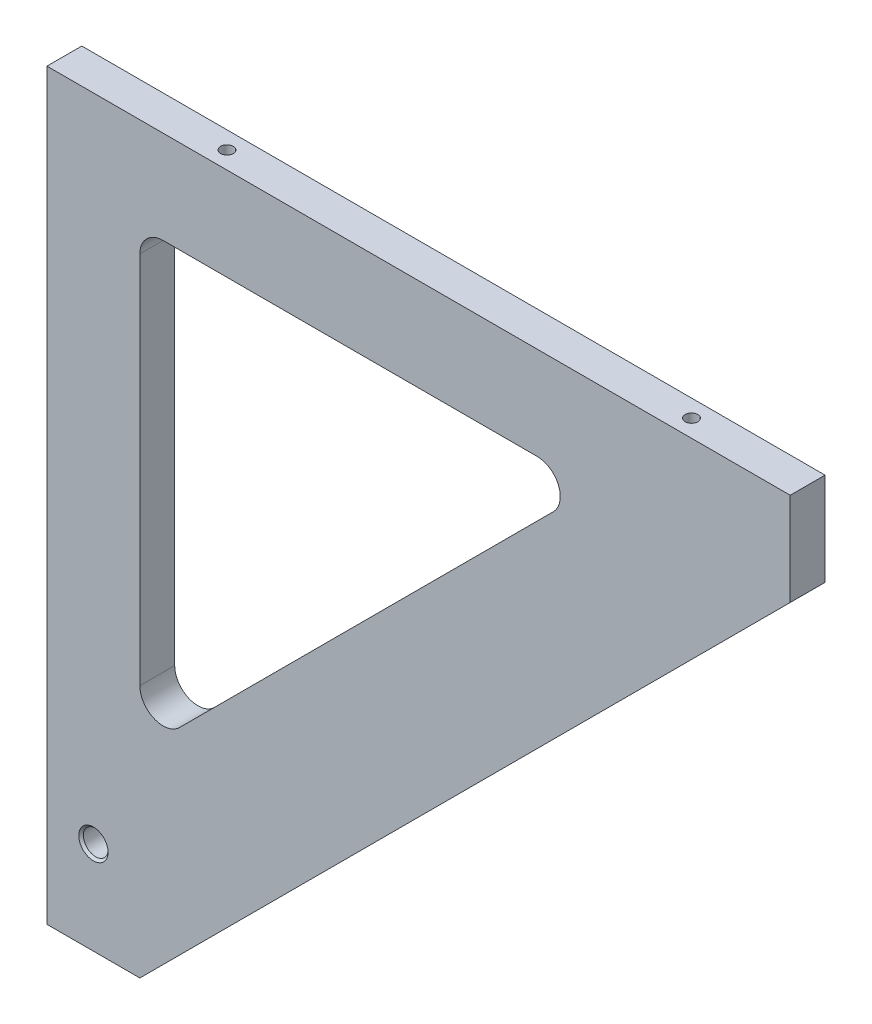
ISO-10303-21;
HEADER;
FILE_DESCRIPTION(('STEP AP214'),'2;1');
FILE_NAME('part.step','',(''),(''),'','','');
FILE_SCHEMA(('AUTOMOTIVE_DESIGN { 1 0 10303 214 1 1 1 1 }'));
ENDSEC;
DATA;
#1=APPLICATION_CONTEXT('core data for automotive mechanical design processes');
#2=APPLICATION_PROTOCOL_DEFINITION('international standard','automotive_design',2000,#1);
#3=PRODUCT_CONTEXT('',#1,'mechanical');
#4=PRODUCT('Part','Part','',(#3));
#5=PRODUCT_RELATED_PRODUCT_CATEGORY('part','',(#4));
#6=PRODUCT_DEFINITION_FORMATION('','',#4);
#7=PRODUCT_DEFINITION_CONTEXT('part definition',#1,'design');
#8=PRODUCT_DEFINITION('design','',#6,#7);
#9=PRODUCT_DEFINITION_SHAPE('','',#8);
#10=(LENGTH_UNIT() NAMED_UNIT(*) SI_UNIT(.MILLI.,.METRE.));
#11=(NAMED_UNIT(*) PLANE_ANGLE_UNIT() SI_UNIT($,.RADIAN.));
#12=(NAMED_UNIT(*) SI_UNIT($,.STERADIAN.) SOLID_ANGLE_UNIT());
#13=UNCERTAINTY_MEASURE_WITH_UNIT(LENGTH_MEASURE(1.E-05),#10,'distance_accuracy_value','');
#14=(GEOMETRIC_REPRESENTATION_CONTEXT(3) GLOBAL_UNCERTAINTY_ASSIGNED_CONTEXT((#13)) GLOBAL_UNIT_ASSIGNED_CONTEXT((#10,
#11,#12)) REPRESENTATION_CONTEXT('',''));
#15=CARTESIAN_POINT('',(0.,0.,0.));
#16=DIRECTION('',(0.,0.,1.));
#17=DIRECTION('',(1.,0.,0.));
#18=AXIS2_PLACEMENT_3D('',#15,#16,#17);
#19=CARTESIAN_POINT('',(25.4,-203.200000000002,4.7625));
#20=DIRECTION('',(0.,1.,0.));
#21=DIRECTION('',(0.,0.,1.));
#22=AXIS2_PLACEMENT_3D('',#19,#20,#21);
#23=PLANE('',#22);
#24=DIRECTION('',(1.,0.,0.));
#25=VECTOR('',#24,1.);
#26=CARTESIAN_POINT('',(25.4,-203.200000000002,-4.7625));
#27=LINE('',#26,#25);
#28=CARTESIAN_POINT('',(0.,-203.200000000002,-4.7625));
#29=VERTEX_POINT('',#28);
#30=CARTESIAN_POINT('',(25.4,-203.200000000002,-4.7625));
#31=VERTEX_POINT('',#30);
#32=EDGE_CURVE('E147',#29,#31,#27,.T.);
#33=ORIENTED_EDGE('',*,*,#32,.T.);
#34=DIRECTION('',(0.,0.,-1.));
#35=VECTOR('',#34,1.);
#36=CARTESIAN_POINT('',(25.4,-203.200000000002,4.7625));
#37=LINE('',#36,#35);
#38=CARTESIAN_POINT('',(25.4,-203.200000000002,4.7625));
#39=VERTEX_POINT('',#38);
#40=EDGE_CURVE('E181',#39,#31,#37,.T.);
#41=ORIENTED_EDGE('',*,*,#40,.F.);
#42=DIRECTION('',(1.,0.,0.));
#43=VECTOR('',#42,1.);
#44=CARTESIAN_POINT('',(25.4,-203.200000000002,4.7625));
#45=LINE('',#44,#43);
#46=CARTESIAN_POINT('',(0.,-203.200000000002,4.7625));
#47=VERTEX_POINT('',#46);
#48=EDGE_CURVE('E148',#47,#39,#45,.T.);
#49=ORIENTED_EDGE('',*,*,#48,.F.);
#50=DIRECTION('',(0.,0.,-1.));
#51=VECTOR('',#50,1.);
#52=CARTESIAN_POINT('',(0.,-203.200000000002,4.7625));
#53=LINE('',#52,#51);
#54=EDGE_CURVE('E160',#47,#29,#53,.T.);
#55=ORIENTED_EDGE('',*,*,#54,.T.);
#56=EDGE_LOOP('',(#33,#41,#49,#55));
#57=FACE_BOUND('',#56,.T.);
#58=ADVANCED_FACE('F36',(#57),#23,.F.);
#59=CARTESIAN_POINT('',(203.2,-25.4,4.7625));
#60=DIRECTION('',(-0.707106781186551,0.707106781186543,0.));
#61=DIRECTION('',(-0.707106781186544,-0.707106781186552,0.));
#62=AXIS2_PLACEMENT_3D('',#59,#60,#61);
#63=PLANE('',#62);
#64=DIRECTION('',(0.707106781186543,0.707106781186551,0.));
#65=VECTOR('',#64,1.);
#66=CARTESIAN_POINT('',(203.2,-25.4,-4.7625));
#67=LINE('',#66,#65);
#68=CARTESIAN_POINT('',(203.2,-25.4,-4.7625));
#69=VERTEX_POINT('',#68);
#70=EDGE_CURVE('E163',#31,#69,#67,.T.);
#71=ORIENTED_EDGE('',*,*,#70,.T.);
#72=DIRECTION('',(0.,0.,-1.));
#73=VECTOR('',#72,1.);
#74=CARTESIAN_POINT('',(203.2,-25.4,4.7625));
#75=LINE('',#74,#73);
#76=CARTESIAN_POINT('',(203.2,-25.4,4.7625));
#77=VERTEX_POINT('',#76);
#78=EDGE_CURVE('E178',#77,#69,#75,.T.);
#79=ORIENTED_EDGE('',*,*,#78,.F.);
#80=DIRECTION('',(0.707106781186543,0.707106781186551,0.));
#81=VECTOR('',#80,1.);
#82=CARTESIAN_POINT('',(203.2,-25.4,4.7625));
#83=LINE('',#82,#81);
#84=EDGE_CURVE('E151',#39,#77,#83,.T.);
#85=ORIENTED_EDGE('',*,*,#84,.F.);
#86=ORIENTED_EDGE('',*,*,#40,.T.);
#87=EDGE_LOOP('',(#71,#79,#85,#86));
#88=FACE_BOUND('',#87,.T.);
#89=ADVANCED_FACE('F273',(#88),#63,.F.);
#90=CARTESIAN_POINT('',(203.2,0.,4.7625));
#91=DIRECTION('',(-1.,0.,0.));
#92=DIRECTION('',(0.,0.,1.));
#93=AXIS2_PLACEMENT_3D('',#90,#91,#92);
#94=PLANE('',#93);
#95=DIRECTION('',(0.,1.,0.));
#96=VECTOR('',#95,1.);
#97=CARTESIAN_POINT('',(203.2,0.,-4.7625));
#98=LINE('',#97,#96);
#99=CARTESIAN_POINT('',(203.2,0.,-4.7625));
#100=VERTEX_POINT('',#99);
#101=EDGE_CURVE('E165',#69,#100,#98,.T.);
#102=ORIENTED_EDGE('',*,*,#101,.T.);
#103=DIRECTION('',(0.,0.,-1.));
#104=VECTOR('',#103,1.);
#105=CARTESIAN_POINT('',(203.2,0.,4.7625));
#106=LINE('',#105,#104);
#107=CARTESIAN_POINT('',(203.2,0.,4.7625));
#108=VERTEX_POINT('',#107);
#109=EDGE_CURVE('E175',#108,#100,#106,.T.);
#110=ORIENTED_EDGE('',*,*,#109,.F.);
#111=DIRECTION('',(0.,1.,0.));
#112=VECTOR('',#111,1.);
#113=CARTESIAN_POINT('',(203.2,0.,4.7625));
#114=LINE('',#113,#112);
#115=EDGE_CURVE('E154',#77,#108,#114,.T.);
#116=ORIENTED_EDGE('',*,*,#115,.F.);
#117=ORIENTED_EDGE('',*,*,#78,.T.);
#118=EDGE_LOOP('',(#102,#110,#116,#117));
#119=FACE_BOUND('',#118,.T.);
#120=ADVANCED_FACE('F278',(#119),#94,.F.);
#121=CARTESIAN_POINT('',(0.,0.,4.7625));
#122=DIRECTION('',(0.,-1.,0.));
#123=DIRECTION('',(0.,0.,-1.));
#124=AXIS2_PLACEMENT_3D('',#121,#122,#123);
#125=PLANE('',#124);
#126=CARTESIAN_POINT('',(44.45,0.,0.));
#127=DIRECTION('',(0.,1.,0.));
#128=DIRECTION('',(0.,0.,1.));
#129=AXIS2_PLACEMENT_3D('',#126,#127,#128);
#130=CIRCLE('',#129,1.72719999999999);
#131=CARTESIAN_POINT('',(44.45,0.,1.72719999999999));
#132=VERTEX_POINT('',#131);
#133=EDGE_CURVE('E135',#132,#132,#130,.T.);
#134=ORIENTED_EDGE('',*,*,#133,.F.);
#135=EDGE_LOOP('',(#134));
#136=FACE_BOUND('',#135,.T.);
#137=CARTESIAN_POINT('',(171.45,0.,0.));
#138=DIRECTION('',(0.,1.,0.));
#139=DIRECTION('',(0.,0.,1.));
#140=AXIS2_PLACEMENT_3D('',#137,#138,#139);
#141=CIRCLE('',#140,1.72719999999998);
#142=CARTESIAN_POINT('',(171.45,0.,1.72719999999998));
#143=VERTEX_POINT('',#142);
#144=EDGE_CURVE('E134',#143,#143,#141,.T.);
#145=ORIENTED_EDGE('',*,*,#144,.F.);
#146=EDGE_LOOP('',(#145));
#147=FACE_BOUND('',#146,.T.);
#148=DIRECTION('',(-1.,0.,0.));
#149=VECTOR('',#148,1.);
#150=CARTESIAN_POINT('',(0.,0.,-4.7625));
#151=LINE('',#150,#149);
#152=CARTESIAN_POINT('',(0.,0.,-4.7625));
#153=VERTEX_POINT('',#152);
#154=EDGE_CURVE('E167',#100,#153,#151,.T.);
#155=ORIENTED_EDGE('',*,*,#154,.T.);
#156=DIRECTION('',(0.,0.,-1.));
#157=VECTOR('',#156,1.);
#158=CARTESIAN_POINT('',(0.,0.,4.7625));
#159=LINE('',#158,#157);
#160=CARTESIAN_POINT('',(0.,0.,4.7625));
#161=VERTEX_POINT('',#160);
#162=EDGE_CURVE('E172',#161,#153,#159,.T.);
#163=ORIENTED_EDGE('',*,*,#162,.F.);
#164=DIRECTION('',(-1.,0.,0.));
#165=VECTOR('',#164,1.);
#166=CARTESIAN_POINT('',(0.,0.,4.7625));
#167=LINE('',#166,#165);
#168=EDGE_CURVE('E156',#108,#161,#167,.T.);
#169=ORIENTED_EDGE('',*,*,#168,.F.);
#170=ORIENTED_EDGE('',*,*,#109,.T.);
#171=EDGE_LOOP('',(#155,#163,#169,#170));
#172=FACE_BOUND('',#171,.T.);
#173=ADVANCED_FACE('F282',(#136,#147,#172),#125,.F.);
#174=CARTESIAN_POINT('',(0.,-203.200000000002,4.7625));
#175=DIRECTION('',(1.,0.,0.));
#176=DIRECTION('',(0.,0.,-1.));
#177=AXIS2_PLACEMENT_3D('',#174,#175,#176);
#178=PLANE('',#177);
#179=DIRECTION('',(0.,-1.,0.));
#180=VECTOR('',#179,1.);
#181=CARTESIAN_POINT('',(0.,-203.200000000002,-4.7625));
#182=LINE('',#181,#180);
#183=EDGE_CURVE('E152',#153,#29,#182,.T.);
#184=ORIENTED_EDGE('',*,*,#183,.T.);
#185=ORIENTED_EDGE('',*,*,#54,.F.);
#186=DIRECTION('',(0.,-1.,0.));
#187=VECTOR('',#186,1.);
#188=CARTESIAN_POINT('',(0.,-203.200000000002,4.7625));
#189=LINE('',#188,#187);
#190=EDGE_CURVE('E158',#161,#47,#189,.T.);
#191=ORIENTED_EDGE('',*,*,#190,.F.);
#192=ORIENTED_EDGE('',*,*,#162,.T.);
#193=EDGE_LOOP('',(#184,#185,#191,#192));
#194=FACE_BOUND('',#193,.T.);
#195=ADVANCED_FACE('F263',(#194),#178,.F.);
#196=CARTESIAN_POINT('',(0.,0.,4.7625));
#197=DIRECTION('',(0.,0.,-1.));
#198=DIRECTION('',(-1.,0.,0.));
#199=AXIS2_PLACEMENT_3D('',#196,#197,#198);
#200=PLANE('',#199);
#201=DIRECTION('',(0.,-1.,0.));
#202=VECTOR('',#201,1.);
#203=CARTESIAN_POINT('',(25.4,-25.4,4.7625));
#204=LINE('',#203,#202);
#205=CARTESIAN_POINT('',(25.4,-31.75,4.7625));
#206=VERTEX_POINT('',#205);
#207=CARTESIAN_POINT('',(25.4,-133.988207152518,4.7625));
#208=VERTEX_POINT('',#207);
#209=EDGE_CURVE('E211',#206,#208,#204,.T.);
#210=ORIENTED_EDGE('',*,*,#209,.F.);
#211=CARTESIAN_POINT('',(31.75,-31.75,4.7625));
#212=DIRECTION('',(0.,0.,-1.));
#213=DIRECTION('',(-1.,0.,0.));
#214=AXIS2_PLACEMENT_3D('',#211,#212,#213);
#215=CIRCLE('',#214,6.35);
#216=CARTESIAN_POINT('',(31.75,-25.4,4.7625));
#217=VERTEX_POINT('',#216);
#218=EDGE_CURVE('E44',#206,#217,#215,.T.);
#219=ORIENTED_EDGE('',*,*,#218,.T.);
#220=DIRECTION('',(-1.,0.,0.));
#221=VECTOR('',#220,1.);
#222=CARTESIAN_POINT('',(149.318463273587,-25.4,4.7625));
#223=LINE('',#222,#221);
#224=CARTESIAN_POINT('',(133.988207152518,-25.4,4.7625));
#225=VERTEX_POINT('',#224);
#226=EDGE_CURVE('E209',#225,#217,#223,.T.);
#227=ORIENTED_EDGE('',*,*,#226,.F.);
#228=CARTESIAN_POINT('',(133.988207152518,-31.75,4.7625));
#229=DIRECTION('',(0.,0.,-1.));
#230=DIRECTION('',(-1.,0.,0.));
#231=AXIS2_PLACEMENT_3D('',#228,#229,#230);
#232=CIRCLE('',#231,6.35);
#233=CARTESIAN_POINT('',(138.478335213052,-36.2401280605346,4.7625));
#234=VERTEX_POINT('',#233);
#235=EDGE_CURVE('E202',#225,#234,#232,.T.);
#236=ORIENTED_EDGE('',*,*,#235,.T.);
#237=DIRECTION('',(0.707106781186548,0.707106781186547,0.));
#238=VECTOR('',#237,1.);
#239=CARTESIAN_POINT('',(25.4,-149.318463273587,4.7625));
#240=LINE('',#239,#238);
#241=CARTESIAN_POINT('',(36.2401280605346,-138.478335213052,4.7625));
#242=VERTEX_POINT('',#241);
#243=EDGE_CURVE('E232',#242,#234,#240,.T.);
#244=ORIENTED_EDGE('',*,*,#243,.F.);
#245=CARTESIAN_POINT('',(31.75,-133.988207152518,4.7625));
#246=DIRECTION('',(0.,0.,-1.));
#247=DIRECTION('',(-1.,0.,0.));
#248=AXIS2_PLACEMENT_3D('',#245,#246,#247);
#249=CIRCLE('',#248,6.35);
#250=EDGE_CURVE('E198',#242,#208,#249,.T.);
#251=ORIENTED_EDGE('',*,*,#250,.T.);
#252=EDGE_LOOP('',(#210,#219,#227,#236,#244,#251));
#253=FACE_BOUND('',#252,.T.);
#254=CARTESIAN_POINT('',(12.7,-177.800000000002,4.7625));
#255=DIRECTION('',(0.,0.,1.));
#256=DIRECTION('',(1.,0.,0.));
#257=AXIS2_PLACEMENT_3D('',#254,#255,#256);
#258=CIRCLE('',#257,4.0132);
#259=CARTESIAN_POINT('',(16.7132,-177.800000000002,4.7625));
#260=VERTEX_POINT('',#259);
#261=EDGE_CURVE('E240',#260,#260,#258,.T.);
#262=ORIENTED_EDGE('',*,*,#261,.F.);
#263=EDGE_LOOP('',(#262));
#264=FACE_BOUND('',#263,.T.);
#265=ORIENTED_EDGE('',*,*,#48,.T.);
#266=ORIENTED_EDGE('',*,*,#84,.T.);
#267=ORIENTED_EDGE('',*,*,#115,.T.);
#268=ORIENTED_EDGE('',*,*,#168,.T.);
#269=ORIENTED_EDGE('',*,*,#190,.T.);
#270=EDGE_LOOP('',(#265,#266,#267,#268,#269));
#271=FACE_BOUND('',#270,.T.);
#272=ADVANCED_FACE('F207',(#253,#264,#271),#200,.F.);
#273=CARTESIAN_POINT('',(0.,0.,-4.7625));
#274=DIRECTION('',(0.,0.,-1.));
#275=DIRECTION('',(-1.,0.,0.));
#276=AXIS2_PLACEMENT_3D('',#273,#274,#275);
#277=PLANE('',#276);
#278=DIRECTION('',(0.707106781186548,0.707106781186547,0.));
#279=VECTOR('',#278,1.);
#280=CARTESIAN_POINT('',(25.4,-149.318463273587,-4.7625));
#281=LINE('',#280,#279);
#282=CARTESIAN_POINT('',(36.2401280605346,-138.478335213052,-4.7625));
#283=VERTEX_POINT('',#282);
#284=CARTESIAN_POINT('',(138.478335213052,-36.2401280605346,-4.7625));
#285=VERTEX_POINT('',#284);
#286=EDGE_CURVE('E228',#283,#285,#281,.T.);
#287=ORIENTED_EDGE('',*,*,#286,.T.);
#288=CARTESIAN_POINT('',(133.988207152518,-31.75,-4.7625));
#289=DIRECTION('',(0.,0.,-1.));
#290=DIRECTION('',(-1.,0.,0.));
#291=AXIS2_PLACEMENT_3D('',#288,#289,#290);
#292=CIRCLE('',#291,6.35);
#293=CARTESIAN_POINT('',(133.988207152518,-25.4,-4.7625));
#294=VERTEX_POINT('',#293);
#295=EDGE_CURVE('E58',#285,#294,#292,.F.);
#296=ORIENTED_EDGE('',*,*,#295,.T.);
#297=DIRECTION('',(-1.,0.,0.));
#298=VECTOR('',#297,1.);
#299=CARTESIAN_POINT('',(149.318463273587,-25.4,-4.7625));
#300=LINE('',#299,#298);
#301=CARTESIAN_POINT('',(31.75,-25.4,-4.7625));
#302=VERTEX_POINT('',#301);
#303=EDGE_CURVE('E224',#294,#302,#300,.T.);
#304=ORIENTED_EDGE('',*,*,#303,.T.);
#305=CARTESIAN_POINT('',(31.75,-31.75,-4.7625));
#306=DIRECTION('',(0.,0.,-1.));
#307=DIRECTION('',(-1.,0.,0.));
#308=AXIS2_PLACEMENT_3D('',#305,#306,#307);
#309=CIRCLE('',#308,6.35);
#310=CARTESIAN_POINT('',(25.4,-31.75,-4.7625));
#311=VERTEX_POINT('',#310);
#312=EDGE_CURVE('E11',#302,#311,#309,.F.);
#313=ORIENTED_EDGE('',*,*,#312,.T.);
#314=DIRECTION('',(0.,-1.,0.));
#315=VECTOR('',#314,1.);
#316=CARTESIAN_POINT('',(25.4,-25.4,-4.7625));
#317=LINE('',#316,#315);
#318=CARTESIAN_POINT('',(25.4,-133.988207152518,-4.7625));
#319=VERTEX_POINT('',#318);
#320=EDGE_CURVE('E222',#311,#319,#317,.T.);
#321=ORIENTED_EDGE('',*,*,#320,.T.);
#322=CARTESIAN_POINT('',(31.75,-133.988207152518,-4.7625));
#323=DIRECTION('',(0.,0.,-1.));
#324=DIRECTION('',(-1.,0.,0.));
#325=AXIS2_PLACEMENT_3D('',#322,#323,#324);
#326=CIRCLE('',#325,6.35);
#327=EDGE_CURVE('E200',#319,#283,#326,.F.);
#328=ORIENTED_EDGE('',*,*,#327,.T.);
#329=EDGE_LOOP('',(#287,#296,#304,#313,#321,#328));
#330=FACE_BOUND('',#329,.T.);
#331=CARTESIAN_POINT('',(12.7,-177.800000000002,-4.7625));
#332=DIRECTION('',(0.,0.,1.));
#333=DIRECTION('',(1.,0.,0.));
#334=AXIS2_PLACEMENT_3D('',#331,#332,#333);
#335=CIRCLE('',#334,4.0132);
#336=CARTESIAN_POINT('',(16.7132,-177.800000000002,-4.7625));
#337=VERTEX_POINT('',#336);
#338=EDGE_CURVE('E230',#337,#337,#335,.T.);
#339=ORIENTED_EDGE('',*,*,#338,.T.);
#340=EDGE_LOOP('',(#339));
#341=FACE_BOUND('',#340,.T.);
#342=ORIENTED_EDGE('',*,*,#32,.F.);
#343=ORIENTED_EDGE('',*,*,#183,.F.);
#344=ORIENTED_EDGE('',*,*,#154,.F.);
#345=ORIENTED_EDGE('',*,*,#101,.F.);
#346=ORIENTED_EDGE('',*,*,#70,.F.);
#347=EDGE_LOOP('',(#342,#343,#344,#345,#346));
#348=FACE_BOUND('',#347,.T.);
#349=ADVANCED_FACE('F220',(#330,#341,#348),#277,.T.);
#350=CARTESIAN_POINT('',(171.45,-10.7188,0.));
#351=DIRECTION('',(0.,1.,0.));
#352=DIRECTION('',(0.,0.,1.));
#353=AXIS2_PLACEMENT_3D('',#350,#351,#352);
#354=CONICAL_SURFACE('',#353,1.72719999999998,1.02974425867665);
#355=CARTESIAN_POINT('',(171.45,-11.7566064611844,0.));
#356=VERTEX_POINT('',#355);
#357=VERTEX_LOOP('',#356);
#358=FACE_BOUND('',#357,.T.);
#359=CARTESIAN_POINT('',(171.45,-10.7188,0.));
#360=DIRECTION('',(0.,1.,0.));
#361=DIRECTION('',(0.,0.,1.));
#362=AXIS2_PLACEMENT_3D('',#359,#360,#361);
#363=CIRCLE('',#362,1.72719999999998);
#364=CARTESIAN_POINT('',(171.45,-10.7188,1.72719999999998));
#365=VERTEX_POINT('',#364);
#366=EDGE_CURVE('E138',#365,#365,#363,.T.);
#367=ORIENTED_EDGE('',*,*,#366,.T.);
#368=EDGE_LOOP('',(#367));
#369=FACE_BOUND('',#368,.T.);
#370=ADVANCED_FACE('F288',(#358,#369),#354,.F.);
#371=CARTESIAN_POINT('',(171.45,0.,0.));
#372=DIRECTION('',(0.,1.,0.));
#373=DIRECTION('',(0.,0.,1.));
#374=AXIS2_PLACEMENT_3D('',#371,#372,#373);
#375=CYLINDRICAL_SURFACE('',#374,1.72719999999998);
#376=ORIENTED_EDGE('',*,*,#366,.F.);
#377=EDGE_LOOP('',(#376));
#378=FACE_BOUND('',#377,.T.);
#379=ORIENTED_EDGE('',*,*,#144,.T.);
#380=EDGE_LOOP('',(#379));
#381=FACE_BOUND('',#380,.T.);
#382=ADVANCED_FACE('F128',(#378,#381),#375,.F.);
#383=CARTESIAN_POINT('',(44.45,-10.7188,0.));
#384=DIRECTION('',(0.,1.,0.));
#385=DIRECTION('',(0.,0.,1.));
#386=AXIS2_PLACEMENT_3D('',#383,#384,#385);
#387=CONICAL_SURFACE('',#386,1.7272,1.02974425867665);
#388=CARTESIAN_POINT('',(44.45,-11.7566064611844,0.));
#389=VERTEX_POINT('',#388);
#390=VERTEX_LOOP('',#389);
#391=FACE_BOUND('',#390,.T.);
#392=CARTESIAN_POINT('',(44.45,-10.7188,0.));
#393=DIRECTION('',(0.,1.,0.));
#394=DIRECTION('',(0.,0.,1.));
#395=AXIS2_PLACEMENT_3D('',#392,#393,#394);
#396=CIRCLE('',#395,1.7272);
#397=CARTESIAN_POINT('',(44.45,-10.7188,1.7272));
#398=VERTEX_POINT('',#397);
#399=EDGE_CURVE('E132',#398,#398,#396,.T.);
#400=ORIENTED_EDGE('',*,*,#399,.T.);
#401=EDGE_LOOP('',(#400));
#402=FACE_BOUND('',#401,.T.);
#403=ADVANCED_FACE('F124',(#391,#402),#387,.F.);
#404=CARTESIAN_POINT('',(44.45,0.,0.));
#405=DIRECTION('',(0.,1.,0.));
#406=DIRECTION('',(0.,0.,1.));
#407=AXIS2_PLACEMENT_3D('',#404,#405,#406);
#408=CYLINDRICAL_SURFACE('',#407,1.72719999999999);
#409=ORIENTED_EDGE('',*,*,#399,.F.);
#410=EDGE_LOOP('',(#409));
#411=FACE_BOUND('',#410,.T.);
#412=ORIENTED_EDGE('',*,*,#133,.T.);
#413=EDGE_LOOP('',(#412));
#414=FACE_BOUND('',#413,.T.);
#415=ADVANCED_FACE('F127',(#411,#414),#408,.F.);
#416=CARTESIAN_POINT('',(12.7,-177.800000000002,-4.1275));
#417=DIRECTION('',(0.,0.,-1.));
#418=DIRECTION('',(-1.,0.,0.));
#419=AXIS2_PLACEMENT_3D('',#416,#417,#418);
#420=CONICAL_SURFACE('',#419,3.37819999999999,0.785398163397448);
#421=ORIENTED_EDGE('',*,*,#338,.F.);
#422=EDGE_LOOP('',(#421));
#423=FACE_BOUND('',#422,.T.);
#424=CARTESIAN_POINT('',(12.7,-177.800000000002,-4.1275));
#425=DIRECTION('',(0.,0.,1.));
#426=DIRECTION('',(1.,0.,0.));
#427=AXIS2_PLACEMENT_3D('',#424,#425,#426);
#428=CIRCLE('',#427,3.37819999999999);
#429=CARTESIAN_POINT('',(16.0782,-177.800000000002,-4.1275));
#430=VERTEX_POINT('',#429);
#431=EDGE_CURVE('E141',#430,#430,#428,.T.);
#432=ORIENTED_EDGE('',*,*,#431,.T.);
#433=EDGE_LOOP('',(#432));
#434=FACE_BOUND('',#433,.T.);
#435=ADVANCED_FACE('F248',(#423,#434),#420,.F.);
#436=CARTESIAN_POINT('',(12.7,-177.800000000002,4.7625));
#437=DIRECTION('',(0.,0.,1.));
#438=DIRECTION('',(1.,0.,0.));
#439=AXIS2_PLACEMENT_3D('',#436,#437,#438);
#440=CYLINDRICAL_SURFACE('',#439,3.3782);
#441=ORIENTED_EDGE('',*,*,#431,.F.);
#442=EDGE_LOOP('',(#441));
#443=FACE_BOUND('',#442,.T.);
#444=CARTESIAN_POINT('',(12.7,-177.800000000002,4.1275));
#445=DIRECTION('',(0.,0.,1.));
#446=DIRECTION('',(1.,0.,0.));
#447=AXIS2_PLACEMENT_3D('',#444,#445,#446);
#448=CIRCLE('',#447,3.3782);
#449=CARTESIAN_POINT('',(16.0782,-177.800000000002,4.1275));
#450=VERTEX_POINT('',#449);
#451=EDGE_CURVE('E243',#450,#450,#448,.T.);
#452=ORIENTED_EDGE('',*,*,#451,.T.);
#453=EDGE_LOOP('',(#452));
#454=FACE_BOUND('',#453,.T.);
#455=ADVANCED_FACE('F250',(#443,#454),#440,.F.);
#456=CARTESIAN_POINT('',(12.7,-177.800000000002,4.7625));
#457=DIRECTION('',(0.,0.,1.));
#458=DIRECTION('',(1.,0.,0.));
#459=AXIS2_PLACEMENT_3D('',#456,#457,#458);
#460=CONICAL_SURFACE('',#459,4.0132,0.785398163397448);
#461=ORIENTED_EDGE('',*,*,#451,.F.);
#462=EDGE_LOOP('',(#461));
#463=FACE_BOUND('',#462,.T.);
#464=ORIENTED_EDGE('',*,*,#261,.T.);
#465=EDGE_LOOP('',(#464));
#466=FACE_BOUND('',#465,.T.);
#467=ADVANCED_FACE('F253',(#463,#466),#460,.F.);
#468=CARTESIAN_POINT('',(149.318463273587,-25.4,-4.7625));
#469=DIRECTION('',(0.,1.,0.));
#470=DIRECTION('',(-1.,0.,0.));
#471=AXIS2_PLACEMENT_3D('',#468,#469,#470);
#472=PLANE('',#471);
#473=ORIENTED_EDGE('',*,*,#303,.F.);
#474=DIRECTION('',(0.,0.,1.));
#475=VECTOR('',#474,1.);
#476=CARTESIAN_POINT('',(133.988207152518,-25.4,4.7625));
#477=LINE('',#476,#475);
#478=EDGE_CURVE('E195',#294,#225,#477,.T.);
#479=ORIENTED_EDGE('',*,*,#478,.T.);
#480=ORIENTED_EDGE('',*,*,#226,.T.);
#481=DIRECTION('',(0.,0.,1.));
#482=VECTOR('',#481,1.);
#483=CARTESIAN_POINT('',(31.75,-25.4,-4.7625));
#484=LINE('',#483,#482);
#485=EDGE_CURVE('E51',#217,#302,#484,.F.);
#486=ORIENTED_EDGE('',*,*,#485,.T.);
#487=EDGE_LOOP('',(#473,#479,#480,#486));
#488=FACE_BOUND('',#487,.T.);
#489=ADVANCED_FACE('F214',(#488),#472,.F.);
#490=CARTESIAN_POINT('',(25.4,-149.318463273587,-4.7625));
#491=DIRECTION('',(0.707106781186547,-0.707106781186548,0.));
#492=DIRECTION('',(0.707106781186548,0.707106781186547,0.));
#493=AXIS2_PLACEMENT_3D('',#490,#491,#492);
#494=PLANE('',#493);
#495=ORIENTED_EDGE('',*,*,#286,.F.);
#496=DIRECTION('',(0.,0.,1.));
#497=VECTOR('',#496,1.);
#498=CARTESIAN_POINT('',(36.2401280605346,-138.478335213052,4.7625));
#499=LINE('',#498,#497);
#500=EDGE_CURVE('E186',#283,#242,#499,.T.);
#501=ORIENTED_EDGE('',*,*,#500,.T.);
#502=ORIENTED_EDGE('',*,*,#243,.T.);
#503=DIRECTION('',(0.,0.,1.));
#504=VECTOR('',#503,1.);
#505=CARTESIAN_POINT('',(138.478335213052,-36.2401280605346,-4.7625));
#506=LINE('',#505,#504);
#507=EDGE_CURVE('E184',#234,#285,#506,.F.);
#508=ORIENTED_EDGE('',*,*,#507,.T.);
#509=EDGE_LOOP('',(#495,#501,#502,#508));
#510=FACE_BOUND('',#509,.T.);
#511=ADVANCED_FACE('F317',(#510),#494,.F.);
#512=CARTESIAN_POINT('',(25.4,-25.4,-4.7625));
#513=DIRECTION('',(-1.,0.,0.));
#514=DIRECTION('',(0.,-1.,0.));
#515=AXIS2_PLACEMENT_3D('',#512,#513,#514);
#516=PLANE('',#515);
#517=ORIENTED_EDGE('',*,*,#209,.T.);
#518=DIRECTION('',(0.,0.,1.));
#519=VECTOR('',#518,1.);
#520=CARTESIAN_POINT('',(25.4,-133.988207152518,-4.7625));
#521=LINE('',#520,#519);
#522=EDGE_CURVE('E192',#208,#319,#521,.F.);
#523=ORIENTED_EDGE('',*,*,#522,.T.);
#524=ORIENTED_EDGE('',*,*,#320,.F.);
#525=DIRECTION('',(0.,0.,1.));
#526=VECTOR('',#525,1.);
#527=CARTESIAN_POINT('',(25.4,-31.75,4.7625));
#528=LINE('',#527,#526);
#529=EDGE_CURVE('E189',#311,#206,#528,.T.);
#530=ORIENTED_EDGE('',*,*,#529,.T.);
#531=EDGE_LOOP('',(#517,#523,#524,#530));
#532=FACE_BOUND('',#531,.T.);
#533=ADVANCED_FACE('F226',(#532),#516,.F.);
#534=CARTESIAN_POINT('',(31.75,-133.988207152518,-4.7625));
#535=DIRECTION('',(0.,0.,-1.));
#536=DIRECTION('',(-1.,0.,0.));
#537=AXIS2_PLACEMENT_3D('',#534,#535,#536);
#538=CYLINDRICAL_SURFACE('',#537,6.35);
#539=ORIENTED_EDGE('',*,*,#327,.F.);
#540=ORIENTED_EDGE('',*,*,#522,.F.);
#541=ORIENTED_EDGE('',*,*,#250,.F.);
#542=ORIENTED_EDGE('',*,*,#500,.F.);
#543=EDGE_LOOP('',(#539,#540,#541,#542));
#544=FACE_BOUND('',#543,.T.);
#545=ADVANCED_FACE('F304',(#544),#538,.F.);
#546=CARTESIAN_POINT('',(133.988207152518,-31.75,-4.7625));
#547=DIRECTION('',(0.,0.,-1.));
#548=DIRECTION('',(-1.,0.,0.));
#549=AXIS2_PLACEMENT_3D('',#546,#547,#548);
#550=CYLINDRICAL_SURFACE('',#549,6.35);
#551=ORIENTED_EDGE('',*,*,#295,.F.);
#552=ORIENTED_EDGE('',*,*,#507,.F.);
#553=ORIENTED_EDGE('',*,*,#235,.F.);
#554=ORIENTED_EDGE('',*,*,#478,.F.);
#555=EDGE_LOOP('',(#551,#552,#553,#554));
#556=FACE_BOUND('',#555,.T.);
#557=ADVANCED_FACE('F306',(#556),#550,.F.);
#558=CARTESIAN_POINT('',(31.75,-31.75,-4.7625));
#559=DIRECTION('',(0.,0.,-1.));
#560=DIRECTION('',(-1.,0.,0.));
#561=AXIS2_PLACEMENT_3D('',#558,#559,#560);
#562=CYLINDRICAL_SURFACE('',#561,6.35);
#563=ORIENTED_EDGE('',*,*,#312,.F.);
#564=ORIENTED_EDGE('',*,*,#485,.F.);
#565=ORIENTED_EDGE('',*,*,#218,.F.);
#566=ORIENTED_EDGE('',*,*,#529,.F.);
#567=EDGE_LOOP('',(#563,#564,#565,#566));
#568=FACE_BOUND('',#567,.T.);
#569=ADVANCED_FACE('F38',(#568),#562,.F.);
#570=CLOSED_SHELL('',(#58,#89,#120,#173,#195,#272,#349,#370,#382,#403,#415,#435,#455,#467,#489,
#511,#533,#545,#557,#569));
#571=MANIFOLD_SOLID_BREP('B2',#570);
#572=ADVANCED_BREP_SHAPE_REPRESENTATION('',(#18,#571),#14);
#573=SHAPE_DEFINITION_REPRESENTATION(#9,#572);
ENDSEC;
END-ISO-10303-21;
